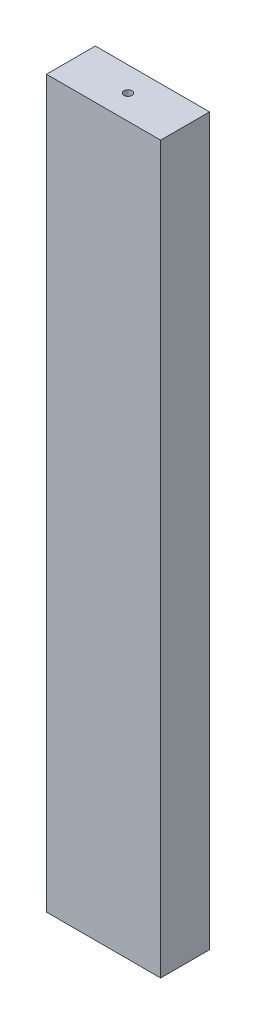
ISO-10303-21;
HEADER;
FILE_DESCRIPTION(('STEP AP214'),'2;1');
FILE_NAME('part.step','',(''),(''),'','','');
FILE_SCHEMA(('AUTOMOTIVE_DESIGN { 1 0 10303 214 1 1 1 1 }'));
ENDSEC;
DATA;
#1=APPLICATION_CONTEXT('core data for automotive mechanical design processes');
#2=APPLICATION_PROTOCOL_DEFINITION('international standard','automotive_design',2000,#1);
#3=PRODUCT_CONTEXT('',#1,'mechanical');
#4=PRODUCT('Part','Part','',(#3));
#5=PRODUCT_RELATED_PRODUCT_CATEGORY('part','',(#4));
#6=PRODUCT_DEFINITION_FORMATION('','',#4);
#7=PRODUCT_DEFINITION_CONTEXT('part definition',#1,'design');
#8=PRODUCT_DEFINITION('design','',#6,#7);
#9=PRODUCT_DEFINITION_SHAPE('','',#8);
#10=(LENGTH_UNIT() NAMED_UNIT(*) SI_UNIT(.MILLI.,.METRE.));
#11=(NAMED_UNIT(*) PLANE_ANGLE_UNIT() SI_UNIT($,.RADIAN.));
#12=(NAMED_UNIT(*) SI_UNIT($,.STERADIAN.) SOLID_ANGLE_UNIT());
#13=UNCERTAINTY_MEASURE_WITH_UNIT(LENGTH_MEASURE(1.E-05),#10,'distance_accuracy_value','');
#14=(GEOMETRIC_REPRESENTATION_CONTEXT(3) GLOBAL_UNCERTAINTY_ASSIGNED_CONTEXT((#13)) GLOBAL_UNIT_ASSIGNED_CONTEXT((#10,
#11,#12)) REPRESENTATION_CONTEXT('',''));
#15=CARTESIAN_POINT('',(0.,0.,0.));
#16=DIRECTION('',(0.,0.,1.));
#17=DIRECTION('',(1.,0.,0.));
#18=AXIS2_PLACEMENT_3D('',#15,#16,#17);
#19=CARTESIAN_POINT('',(0.,565.15,0.));
#20=DIRECTION('',(1.,0.,0.));
#21=DIRECTION('',(0.,0.,-1.));
#22=AXIS2_PLACEMENT_3D('',#19,#20,#21);
#23=PLANE('',#22);
#24=DIRECTION('',(0.,0.,1.));
#25=VECTOR('',#24,1.);
#26=CARTESIAN_POINT('',(0.,0.,0.));
#27=LINE('',#26,#25);
#28=CARTESIAN_POINT('',(0.,0.,-38.1));
#29=VERTEX_POINT('',#28);
#30=CARTESIAN_POINT('',(0.,0.,0.));
#31=VERTEX_POINT('',#30);
#32=EDGE_CURVE('E107',#29,#31,#27,.T.);
#33=ORIENTED_EDGE('',*,*,#32,.T.);
#34=DIRECTION('',(0.,-1.,0.));
#35=VECTOR('',#34,1.);
#36=CARTESIAN_POINT('',(0.,565.15,0.));
#37=LINE('',#36,#35);
#38=CARTESIAN_POINT('',(0.,565.15,0.));
#39=VERTEX_POINT('',#38);
#40=EDGE_CURVE('E11',#39,#31,#37,.T.);
#41=ORIENTED_EDGE('',*,*,#40,.F.);
#42=DIRECTION('',(0.,0.,1.));
#43=VECTOR('',#42,1.);
#44=CARTESIAN_POINT('',(0.,565.15,0.));
#45=LINE('',#44,#43);
#46=CARTESIAN_POINT('',(0.,565.15,-38.1));
#47=VERTEX_POINT('',#46);
#48=EDGE_CURVE('E91',#47,#39,#45,.T.);
#49=ORIENTED_EDGE('',*,*,#48,.F.);
#50=DIRECTION('',(0.,-1.,0.));
#51=VECTOR('',#50,1.);
#52=CARTESIAN_POINT('',(0.,565.15,-38.1));
#53=LINE('',#52,#51);
#54=EDGE_CURVE('E103',#47,#29,#53,.T.);
#55=ORIENTED_EDGE('',*,*,#54,.T.);
#56=EDGE_LOOP('',(#33,#41,#49,#55));
#57=FACE_BOUND('',#56,.T.);
#58=ADVANCED_FACE('F39',(#57),#23,.F.);
#59=CARTESIAN_POINT('',(0.,565.15,0.));
#60=DIRECTION('',(0.,0.,-1.));
#61=DIRECTION('',(-1.,0.,0.));
#62=AXIS2_PLACEMENT_3D('',#59,#60,#61);
#63=PLANE('',#62);
#64=DIRECTION('',(1.,0.,0.));
#65=VECTOR('',#64,1.);
#66=CARTESIAN_POINT('',(0.,0.,0.));
#67=LINE('',#66,#65);
#68=CARTESIAN_POINT('',(88.9,0.,0.));
#69=VERTEX_POINT('',#68);
#70=EDGE_CURVE('E96',#31,#69,#67,.T.);
#71=ORIENTED_EDGE('',*,*,#70,.T.);
#72=DIRECTION('',(0.,-1.,0.));
#73=VECTOR('',#72,1.);
#74=CARTESIAN_POINT('',(88.9,565.15,0.));
#75=LINE('',#74,#73);
#76=CARTESIAN_POINT('',(88.9,565.15,0.));
#77=VERTEX_POINT('',#76);
#78=EDGE_CURVE('E48',#77,#69,#75,.T.);
#79=ORIENTED_EDGE('',*,*,#78,.F.);
#80=DIRECTION('',(1.,0.,0.));
#81=VECTOR('',#80,1.);
#82=CARTESIAN_POINT('',(0.,565.15,0.));
#83=LINE('',#82,#81);
#84=EDGE_CURVE('E86',#39,#77,#83,.T.);
#85=ORIENTED_EDGE('',*,*,#84,.F.);
#86=ORIENTED_EDGE('',*,*,#40,.T.);
#87=EDGE_LOOP('',(#71,#79,#85,#86));
#88=FACE_BOUND('',#87,.T.);
#89=ADVANCED_FACE('F95',(#88),#63,.F.);
#90=CARTESIAN_POINT('',(88.9,565.15,0.));
#91=DIRECTION('',(-1.,0.,0.));
#92=DIRECTION('',(0.,0.,1.));
#93=AXIS2_PLACEMENT_3D('',#90,#91,#92);
#94=PLANE('',#93);
#95=DIRECTION('',(0.,0.,-1.));
#96=VECTOR('',#95,1.);
#97=CARTESIAN_POINT('',(88.9,0.,0.));
#98=LINE('',#97,#96);
#99=CARTESIAN_POINT('',(88.9,0.,-38.1));
#100=VERTEX_POINT('',#99);
#101=EDGE_CURVE('E73',#69,#100,#98,.T.);
#102=ORIENTED_EDGE('',*,*,#101,.T.);
#103=DIRECTION('',(0.,-1.,0.));
#104=VECTOR('',#103,1.);
#105=CARTESIAN_POINT('',(88.9,565.15,-38.1));
#106=LINE('',#105,#104);
#107=CARTESIAN_POINT('',(88.9,565.15,-38.1));
#108=VERTEX_POINT('',#107);
#109=EDGE_CURVE('E98',#108,#100,#106,.T.);
#110=ORIENTED_EDGE('',*,*,#109,.F.);
#111=DIRECTION('',(0.,0.,-1.));
#112=VECTOR('',#111,1.);
#113=CARTESIAN_POINT('',(88.9,565.15,0.));
#114=LINE('',#113,#112);
#115=EDGE_CURVE('E89',#77,#108,#114,.T.);
#116=ORIENTED_EDGE('',*,*,#115,.F.);
#117=ORIENTED_EDGE('',*,*,#78,.T.);
#118=EDGE_LOOP('',(#102,#110,#116,#117));
#119=FACE_BOUND('',#118,.T.);
#120=ADVANCED_FACE('F99',(#119),#94,.F.);
#121=CARTESIAN_POINT('',(0.,565.15,-38.1));
#122=DIRECTION('',(0.,0.,1.));
#123=DIRECTION('',(1.,0.,0.));
#124=AXIS2_PLACEMENT_3D('',#121,#122,#123);
#125=PLANE('',#124);
#126=DIRECTION('',(-1.,0.,0.));
#127=VECTOR('',#126,1.);
#128=CARTESIAN_POINT('',(0.,0.,-38.1));
#129=LINE('',#128,#127);
#130=EDGE_CURVE('E79',#100,#29,#129,.T.);
#131=ORIENTED_EDGE('',*,*,#130,.T.);
#132=ORIENTED_EDGE('',*,*,#54,.F.);
#133=DIRECTION('',(-1.,0.,0.));
#134=VECTOR('',#133,1.);
#135=CARTESIAN_POINT('',(0.,565.15,-38.1));
#136=LINE('',#135,#134);
#137=EDGE_CURVE('E56',#108,#47,#136,.T.);
#138=ORIENTED_EDGE('',*,*,#137,.F.);
#139=ORIENTED_EDGE('',*,*,#109,.T.);
#140=EDGE_LOOP('',(#131,#132,#138,#139));
#141=FACE_BOUND('',#140,.T.);
#142=ADVANCED_FACE('F121',(#141),#125,.F.);
#143=CARTESIAN_POINT('',(0.,565.15,0.));
#144=DIRECTION('',(0.,-1.,0.));
#145=DIRECTION('',(0.,0.,-1.));
#146=AXIS2_PLACEMENT_3D('',#143,#144,#145);
#147=PLANE('',#146);
#148=CARTESIAN_POINT('',(44.45,565.15,-19.05));
#149=DIRECTION('',(0.,-1.,0.));
#150=DIRECTION('',(0.,0.,-1.));
#151=AXIS2_PLACEMENT_3D('',#148,#149,#150);
#152=CIRCLE('',#151,3.175);
#153=CARTESIAN_POINT('',(44.45,565.15,-22.225));
#154=VERTEX_POINT('',#153);
#155=EDGE_CURVE('E111',#154,#154,#152,.T.);
#156=ORIENTED_EDGE('',*,*,#155,.T.);
#157=EDGE_LOOP('',(#156));
#158=FACE_BOUND('',#157,.T.);
#159=ORIENTED_EDGE('',*,*,#48,.T.);
#160=ORIENTED_EDGE('',*,*,#84,.T.);
#161=ORIENTED_EDGE('',*,*,#115,.T.);
#162=ORIENTED_EDGE('',*,*,#137,.T.);
#163=EDGE_LOOP('',(#159,#160,#161,#162));
#164=FACE_BOUND('',#163,.T.);
#165=ADVANCED_FACE('F87',(#158,#164),#147,.F.);
#166=CARTESIAN_POINT('',(0.,0.,0.));
#167=DIRECTION('',(0.,-1.,0.));
#168=DIRECTION('',(0.,0.,-1.));
#169=AXIS2_PLACEMENT_3D('',#166,#167,#168);
#170=PLANE('',#169);
#171=CARTESIAN_POINT('',(44.45,0.,-19.05));
#172=DIRECTION('',(0.,-1.,0.));
#173=DIRECTION('',(0.,0.,-1.));
#174=AXIS2_PLACEMENT_3D('',#171,#172,#173);
#175=CIRCLE('',#174,3.175);
#176=CARTESIAN_POINT('',(44.45,0.,-22.225));
#177=VERTEX_POINT('',#176);
#178=EDGE_CURVE('E128',#177,#177,#175,.T.);
#179=ORIENTED_EDGE('',*,*,#178,.F.);
#180=EDGE_LOOP('',(#179));
#181=FACE_BOUND('',#180,.T.);
#182=ORIENTED_EDGE('',*,*,#32,.F.);
#183=ORIENTED_EDGE('',*,*,#130,.F.);
#184=ORIENTED_EDGE('',*,*,#101,.F.);
#185=ORIENTED_EDGE('',*,*,#70,.F.);
#186=EDGE_LOOP('',(#182,#183,#184,#185));
#187=FACE_BOUND('',#186,.T.);
#188=ADVANCED_FACE('F124',(#181,#187),#170,.T.);
#189=CARTESIAN_POINT('',(44.45,565.15,-19.05));
#190=DIRECTION('',(0.,-1.,0.));
#191=DIRECTION('',(0.,0.,-1.));
#192=AXIS2_PLACEMENT_3D('',#189,#190,#191);
#193=CYLINDRICAL_SURFACE('',#192,3.175);
#194=ORIENTED_EDGE('',*,*,#155,.F.);
#195=EDGE_LOOP('',(#194));
#196=FACE_BOUND('',#195,.T.);
#197=ORIENTED_EDGE('',*,*,#178,.T.);
#198=EDGE_LOOP('',(#197));
#199=FACE_BOUND('',#198,.T.);
#200=ADVANCED_FACE('F137',(#196,#199),#193,.F.);
#201=CLOSED_SHELL('',(#58,#89,#120,#142,#165,#188,#200));
#202=MANIFOLD_SOLID_BREP('B2',#201);
#203=ADVANCED_BREP_SHAPE_REPRESENTATION('',(#18,#202),#14);
#204=SHAPE_DEFINITION_REPRESENTATION(#9,#203);
ENDSEC;
END-ISO-10303-21;
